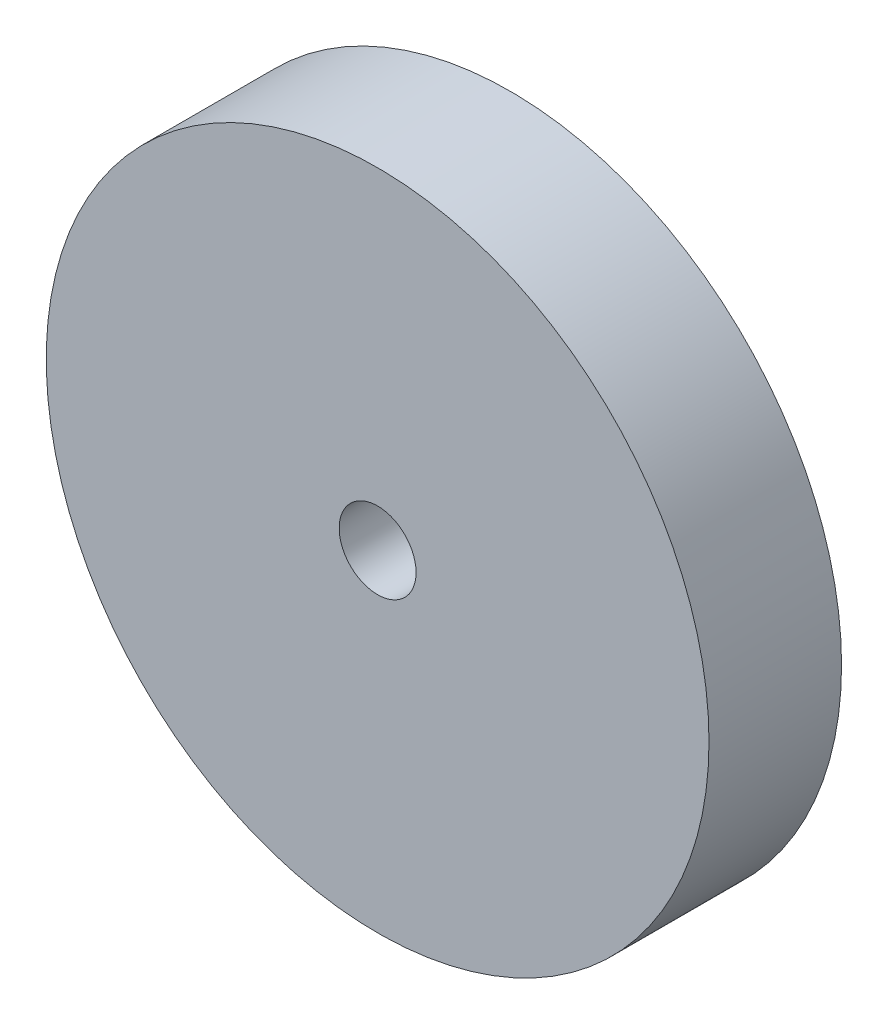
ISO-10303-21;
HEADER;
FILE_DESCRIPTION(('STEP AP214'),'2;1');
FILE_NAME('part.step','',(''),(''),'','','');
FILE_SCHEMA(('AUTOMOTIVE_DESIGN { 1 0 10303 214 1 1 1 1 }'));
ENDSEC;
DATA;
#1=APPLICATION_CONTEXT('core data for automotive mechanical design processes');
#2=APPLICATION_PROTOCOL_DEFINITION('international standard','automotive_design',2000,#1);
#3=PRODUCT_CONTEXT('',#1,'mechanical');
#4=PRODUCT('Part','Part','',(#3));
#5=PRODUCT_RELATED_PRODUCT_CATEGORY('part','',(#4));
#6=PRODUCT_DEFINITION_FORMATION('','',#4);
#7=PRODUCT_DEFINITION_CONTEXT('part definition',#1,'design');
#8=PRODUCT_DEFINITION('design','',#6,#7);
#9=PRODUCT_DEFINITION_SHAPE('','',#8);
#10=(LENGTH_UNIT() NAMED_UNIT(*) SI_UNIT(.MILLI.,.METRE.));
#11=(NAMED_UNIT(*) PLANE_ANGLE_UNIT() SI_UNIT($,.RADIAN.));
#12=(NAMED_UNIT(*) SI_UNIT($,.STERADIAN.) SOLID_ANGLE_UNIT());
#13=UNCERTAINTY_MEASURE_WITH_UNIT(LENGTH_MEASURE(1.E-05),#10,'distance_accuracy_value','');
#14=(GEOMETRIC_REPRESENTATION_CONTEXT(3) GLOBAL_UNCERTAINTY_ASSIGNED_CONTEXT((#13)) GLOBAL_UNIT_ASSIGNED_CONTEXT((#10,
#11,#12)) REPRESENTATION_CONTEXT('',''));
#15=CARTESIAN_POINT('',(0.,0.,0.));
#16=DIRECTION('',(0.,0.,1.));
#17=DIRECTION('',(1.,0.,0.));
#18=AXIS2_PLACEMENT_3D('',#15,#16,#17);
#19=CARTESIAN_POINT('',(0.,0.,5.08));
#20=DIRECTION('',(0.,0.,-1.));
#21=DIRECTION('',(-1.,0.,0.));
#22=AXIS2_PLACEMENT_3D('',#19,#20,#21);
#23=CYLINDRICAL_SURFACE('',#22,12.7);
#24=CARTESIAN_POINT('',(0.,0.,5.08));
#25=DIRECTION('',(0.,0.,1.));
#26=DIRECTION('',(1.,0.,0.));
#27=AXIS2_PLACEMENT_3D('',#24,#25,#26);
#28=CIRCLE('',#27,12.7);
#29=CARTESIAN_POINT('',(12.7,0.,5.08));
#30=VERTEX_POINT('',#29);
#31=EDGE_CURVE('E10',#30,#30,#28,.T.);
#32=ORIENTED_EDGE('',*,*,#31,.F.);
#33=EDGE_LOOP('',(#32));
#34=FACE_BOUND('',#33,.T.);
#35=CARTESIAN_POINT('',(0.,0.,0.));
#36=DIRECTION('',(0.,0.,1.));
#37=DIRECTION('',(1.,0.,0.));
#38=AXIS2_PLACEMENT_3D('',#35,#36,#37);
#39=CIRCLE('',#38,12.7);
#40=CARTESIAN_POINT('',(12.7,0.,0.));
#41=VERTEX_POINT('',#40);
#42=EDGE_CURVE('E37',#41,#41,#39,.T.);
#43=ORIENTED_EDGE('',*,*,#42,.T.);
#44=EDGE_LOOP('',(#43));
#45=FACE_BOUND('',#44,.T.);
#46=ADVANCED_FACE('F34',(#34,#45),#23,.T.);
#47=CARTESIAN_POINT('',(0.,0.,5.08));
#48=DIRECTION('',(0.,0.,1.));
#49=DIRECTION('',(1.,0.,0.));
#50=AXIS2_PLACEMENT_3D('',#47,#48,#49);
#51=PLANE('',#50);
#52=CARTESIAN_POINT('',(0.,0.,5.08));
#53=DIRECTION('',(0.,0.,1.));
#54=DIRECTION('',(1.,0.,0.));
#55=AXIS2_PLACEMENT_3D('',#52,#53,#54);
#56=CIRCLE('',#55,1.4732);
#57=CARTESIAN_POINT('',(1.4732,0.,5.08));
#58=VERTEX_POINT('',#57);
#59=EDGE_CURVE('E46',#58,#58,#56,.T.);
#60=ORIENTED_EDGE('',*,*,#59,.F.);
#61=EDGE_LOOP('',(#60));
#62=FACE_BOUND('',#61,.T.);
#63=ORIENTED_EDGE('',*,*,#31,.T.);
#64=EDGE_LOOP('',(#63));
#65=FACE_BOUND('',#64,.T.);
#66=ADVANCED_FACE('F61',(#62,#65),#51,.T.);
#67=CARTESIAN_POINT('',(0.,0.,0.));
#68=DIRECTION('',(0.,0.,1.));
#69=DIRECTION('',(1.,0.,0.));
#70=AXIS2_PLACEMENT_3D('',#67,#68,#69);
#71=PLANE('',#70);
#72=CARTESIAN_POINT('',(0.,0.,0.));
#73=DIRECTION('',(0.,0.,1.));
#74=DIRECTION('',(1.,0.,0.));
#75=AXIS2_PLACEMENT_3D('',#72,#73,#74);
#76=CIRCLE('',#75,1.4732);
#77=CARTESIAN_POINT('',(1.4732,0.,0.));
#78=VERTEX_POINT('',#77);
#79=EDGE_CURVE('E44',#78,#78,#76,.T.);
#80=ORIENTED_EDGE('',*,*,#79,.T.);
#81=EDGE_LOOP('',(#80));
#82=FACE_BOUND('',#81,.T.);
#83=ORIENTED_EDGE('',*,*,#42,.F.);
#84=EDGE_LOOP('',(#83));
#85=FACE_BOUND('',#84,.T.);
#86=ADVANCED_FACE('F52',(#82,#85),#71,.F.);
#87=CARTESIAN_POINT('',(0.,0.,0.));
#88=DIRECTION('',(0.,0.,1.));
#89=DIRECTION('',(1.,0.,0.));
#90=AXIS2_PLACEMENT_3D('',#87,#88,#89);
#91=CYLINDRICAL_SURFACE('',#90,1.4732);
#92=ORIENTED_EDGE('',*,*,#79,.F.);
#93=EDGE_LOOP('',(#92));
#94=FACE_BOUND('',#93,.T.);
#95=ORIENTED_EDGE('',*,*,#59,.T.);
#96=EDGE_LOOP('',(#95));
#97=FACE_BOUND('',#96,.T.);
#98=ADVANCED_FACE('F55',(#94,#97),#91,.F.);
#99=CLOSED_SHELL('',(#46,#66,#86,#98));
#100=MANIFOLD_SOLID_BREP('B2',#99);
#101=ADVANCED_BREP_SHAPE_REPRESENTATION('',(#18,#100),#14);
#102=SHAPE_DEFINITION_REPRESENTATION(#9,#101);
ENDSEC;
END-ISO-10303-21;
